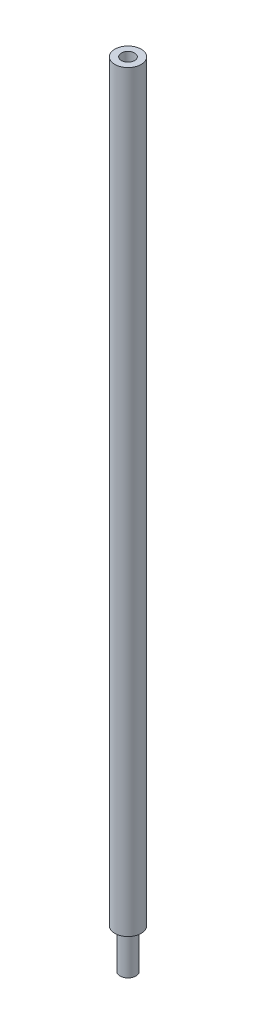
ISO-10303-21;
HEADER;
FILE_DESCRIPTION(('STEP AP214'),'2;1');
FILE_NAME('part.step','',(''),(''),'','','');
FILE_SCHEMA(('AUTOMOTIVE_DESIGN { 1 0 10303 214 1 1 1 1 }'));
ENDSEC;
DATA;
#1=APPLICATION_CONTEXT('core data for automotive mechanical design processes');
#2=APPLICATION_PROTOCOL_DEFINITION('international standard','automotive_design',2000,#1);
#3=PRODUCT_CONTEXT('',#1,'mechanical');
#4=PRODUCT('Part','Part','',(#3));
#5=PRODUCT_RELATED_PRODUCT_CATEGORY('part','',(#4));
#6=PRODUCT_DEFINITION_FORMATION('','',#4);
#7=PRODUCT_DEFINITION_CONTEXT('part definition',#1,'design');
#8=PRODUCT_DEFINITION('design','',#6,#7);
#9=PRODUCT_DEFINITION_SHAPE('','',#8);
#10=(LENGTH_UNIT() NAMED_UNIT(*) SI_UNIT(.MILLI.,.METRE.));
#11=(NAMED_UNIT(*) PLANE_ANGLE_UNIT() SI_UNIT($,.RADIAN.));
#12=(NAMED_UNIT(*) SI_UNIT($,.STERADIAN.) SOLID_ANGLE_UNIT());
#13=UNCERTAINTY_MEASURE_WITH_UNIT(LENGTH_MEASURE(1.E-05),#10,'distance_accuracy_value','');
#14=(GEOMETRIC_REPRESENTATION_CONTEXT(3) GLOBAL_UNCERTAINTY_ASSIGNED_CONTEXT((#13)) GLOBAL_UNIT_ASSIGNED_CONTEXT((#10,
#11,#12)) REPRESENTATION_CONTEXT('',''));
#15=CARTESIAN_POINT('',(0.,0.,0.));
#16=DIRECTION('',(0.,0.,1.));
#17=DIRECTION('',(1.,0.,0.));
#18=AXIS2_PLACEMENT_3D('',#15,#16,#17);
#19=CARTESIAN_POINT('',(0.,64.1903300594672,0.));
#20=DIRECTION('',(0.,-1.,0.));
#21=DIRECTION('',(0.,0.,-1.));
#22=AXIS2_PLACEMENT_3D('',#19,#20,#21);
#23=PLANE('',#22);
#24=CARTESIAN_POINT('',(0.,64.1903300594672,0.));
#25=DIRECTION('',(0.,1.,0.));
#26=DIRECTION('',(0.,0.,1.));
#27=AXIS2_PLACEMENT_3D('',#24,#25,#26);
#28=CIRCLE('',#27,2.5);
#29=CARTESIAN_POINT('',(0.,64.1903300594672,2.5));
#30=VERTEX_POINT('',#29);
#31=EDGE_CURVE('E55',#30,#30,#28,.T.);
#32=ORIENTED_EDGE('',*,*,#31,.F.);
#33=EDGE_LOOP('',(#32));
#34=FACE_BOUND('',#33,.T.);
#35=CARTESIAN_POINT('',(0.,64.1903300594672,0.));
#36=DIRECTION('',(0.,1.,0.));
#37=DIRECTION('',(0.,0.,1.));
#38=AXIS2_PLACEMENT_3D('',#35,#36,#37);
#39=CIRCLE('',#38,5.);
#40=CARTESIAN_POINT('',(0.,64.1903300594672,5.));
#41=VERTEX_POINT('',#40);
#42=EDGE_CURVE('E10',#41,#41,#39,.T.);
#43=ORIENTED_EDGE('',*,*,#42,.T.);
#44=EDGE_LOOP('',(#43));
#45=FACE_BOUND('',#44,.T.);
#46=ADVANCED_FACE('F33',(#34,#45),#23,.F.);
#47=CARTESIAN_POINT('',(0.,68.8439642374539,0.));
#48=DIRECTION('',(0.,1.,0.));
#49=DIRECTION('',(0.,0.,1.));
#50=AXIS2_PLACEMENT_3D('',#47,#48,#49);
#51=CYLINDRICAL_SURFACE('',#50,5.00000000000002);
#52=ORIENTED_EDGE('',*,*,#42,.F.);
#53=EDGE_LOOP('',(#52));
#54=FACE_BOUND('',#53,.T.);
#55=CARTESIAN_POINT('',(0.,-220.809669940533,0.));
#56=DIRECTION('',(0.,1.,0.));
#57=DIRECTION('',(0.,0.,1.));
#58=AXIS2_PLACEMENT_3D('',#55,#56,#57);
#59=CIRCLE('',#58,5.00000000000004);
#60=CARTESIAN_POINT('',(0.,-220.809669940533,5.00000000000004));
#61=VERTEX_POINT('',#60);
#62=EDGE_CURVE('E39',#61,#61,#59,.T.);
#63=ORIENTED_EDGE('',*,*,#62,.T.);
#64=EDGE_LOOP('',(#63));
#65=FACE_BOUND('',#64,.T.);
#66=ADVANCED_FACE('F97',(#54,#65),#51,.T.);
#67=CARTESIAN_POINT('',(0.,-220.809669940533,-5.00000000000004));
#68=DIRECTION('',(0.,1.,0.));
#69=DIRECTION('',(0.,0.,1.));
#70=AXIS2_PLACEMENT_3D('',#67,#68,#69);
#71=PLANE('',#70);
#72=ORIENTED_EDGE('',*,*,#62,.F.);
#73=EDGE_LOOP('',(#72));
#74=FACE_BOUND('',#73,.T.);
#75=CARTESIAN_POINT('',(0.,-220.809669940533,0.));
#76=DIRECTION('',(0.,1.,0.));
#77=DIRECTION('',(0.,0.,1.));
#78=AXIS2_PLACEMENT_3D('',#75,#76,#77);
#79=CIRCLE('',#78,3.00000000000004);
#80=CARTESIAN_POINT('',(0.,-220.809669940533,3.00000000000004));
#81=VERTEX_POINT('',#80);
#82=EDGE_CURVE('E43',#81,#81,#79,.T.);
#83=ORIENTED_EDGE('',*,*,#82,.T.);
#84=EDGE_LOOP('',(#83));
#85=FACE_BOUND('',#84,.T.);
#86=ADVANCED_FACE('F102',(#74,#85),#71,.F.);
#87=CARTESIAN_POINT('',(0.,68.8439642374539,0.));
#88=DIRECTION('',(0.,1.,0.));
#89=DIRECTION('',(0.,0.,1.));
#90=AXIS2_PLACEMENT_3D('',#87,#88,#89);
#91=CYLINDRICAL_SURFACE('',#90,3.00000000000004);
#92=ORIENTED_EDGE('',*,*,#82,.F.);
#93=EDGE_LOOP('',(#92));
#94=FACE_BOUND('',#93,.T.);
#95=CARTESIAN_POINT('',(0.,-235.809669940533,0.));
#96=DIRECTION('',(0.,1.,0.));
#97=DIRECTION('',(0.,0.,1.));
#98=AXIS2_PLACEMENT_3D('',#95,#96,#97);
#99=CIRCLE('',#98,3.00000000000004);
#100=CARTESIAN_POINT('',(0.,-235.809669940533,3.00000000000004));
#101=VERTEX_POINT('',#100);
#102=EDGE_CURVE('E47',#101,#101,#99,.T.);
#103=ORIENTED_EDGE('',*,*,#102,.T.);
#104=EDGE_LOOP('',(#103));
#105=FACE_BOUND('',#104,.T.);
#106=ADVANCED_FACE('F122',(#94,#105),#91,.T.);
#107=CARTESIAN_POINT('',(0.,-235.809669940533,-3.00000000000004));
#108=DIRECTION('',(0.,1.,0.));
#109=DIRECTION('',(0.,0.,1.));
#110=AXIS2_PLACEMENT_3D('',#107,#108,#109);
#111=PLANE('',#110);
#112=CARTESIAN_POINT('',(0.,-235.809669940533,0.));
#113=DIRECTION('',(0.,1.,0.));
#114=DIRECTION('',(0.,0.,1.));
#115=AXIS2_PLACEMENT_3D('',#112,#113,#114);
#116=CIRCLE('',#115,2.00000000000004);
#117=CARTESIAN_POINT('',(0.,-235.809669940533,2.00000000000004));
#118=VERTEX_POINT('',#117);
#119=EDGE_CURVE('E52',#118,#118,#116,.T.);
#120=ORIENTED_EDGE('',*,*,#119,.T.);
#121=EDGE_LOOP('',(#120));
#122=FACE_BOUND('',#121,.T.);
#123=ORIENTED_EDGE('',*,*,#102,.F.);
#124=EDGE_LOOP('',(#123));
#125=FACE_BOUND('',#124,.T.);
#126=ADVANCED_FACE('F115',(#122,#125),#111,.F.);
#127=CARTESIAN_POINT('',(0.,-235.809669940533,0.));
#128=DIRECTION('',(0.,1.,0.));
#129=DIRECTION('',(0.,0.,1.));
#130=AXIS2_PLACEMENT_3D('',#127,#128,#129);
#131=CYLINDRICAL_SURFACE('',#130,2.00000000000004);
#132=ORIENTED_EDGE('',*,*,#119,.F.);
#133=EDGE_LOOP('',(#132));
#134=FACE_BOUND('',#133,.T.);
#135=CARTESIAN_POINT('',(0.,-219.809669940533,0.));
#136=DIRECTION('',(0.,1.,0.));
#137=DIRECTION('',(0.,0.,1.));
#138=AXIS2_PLACEMENT_3D('',#135,#136,#137);
#139=CIRCLE('',#138,2.00000000000004);
#140=CARTESIAN_POINT('',(0.,-219.809669940533,2.00000000000004));
#141=VERTEX_POINT('',#140);
#142=EDGE_CURVE('E65',#141,#141,#139,.T.);
#143=ORIENTED_EDGE('',*,*,#142,.T.);
#144=EDGE_LOOP('',(#143));
#145=FACE_BOUND('',#144,.T.);
#146=ADVANCED_FACE('F108',(#134,#145),#131,.F.);
#147=CARTESIAN_POINT('',(0.,49.1903300594672,0.));
#148=DIRECTION('',(0.,1.,0.));
#149=DIRECTION('',(0.,0.,1.));
#150=AXIS2_PLACEMENT_3D('',#147,#148,#149);
#151=CYLINDRICAL_SURFACE('',#150,2.5);
#152=CARTESIAN_POINT('',(0.,49.1903300594672,0.));
#153=DIRECTION('',(0.,1.,0.));
#154=DIRECTION('',(0.,0.,1.));
#155=AXIS2_PLACEMENT_3D('',#152,#153,#154);
#156=CIRCLE('',#155,2.5);
#157=CARTESIAN_POINT('',(0.,49.1903300594672,2.5));
#158=VERTEX_POINT('',#157);
#159=EDGE_CURVE('E58',#158,#158,#156,.T.);
#160=ORIENTED_EDGE('',*,*,#159,.F.);
#161=EDGE_LOOP('',(#160));
#162=FACE_BOUND('',#161,.T.);
#163=ORIENTED_EDGE('',*,*,#31,.T.);
#164=EDGE_LOOP('',(#163));
#165=FACE_BOUND('',#164,.T.);
#166=ADVANCED_FACE('F106',(#162,#165),#151,.F.);
#167=CARTESIAN_POINT('',(0.,63.1903300594672,0.));
#168=DIRECTION('',(0.,-1.,0.));
#169=DIRECTION('',(0.,0.,-1.));
#170=AXIS2_PLACEMENT_3D('',#167,#168,#169);
#171=PLANE('',#170);
#172=CARTESIAN_POINT('',(0.,63.1903300594672,0.));
#173=DIRECTION('',(0.,-1.,0.));
#174=DIRECTION('',(0.,0.,-1.));
#175=AXIS2_PLACEMENT_3D('',#172,#173,#174);
#176=CIRCLE('',#175,3.5);
#177=CARTESIAN_POINT('',(0.,63.1903300594672,-3.5));
#178=VERTEX_POINT('',#177);
#179=EDGE_CURVE('E66',#178,#178,#176,.F.);
#180=ORIENTED_EDGE('',*,*,#179,.T.);
#181=EDGE_LOOP('',(#180));
#182=FACE_BOUND('',#181,.T.);
#183=CARTESIAN_POINT('',(0.,63.1903300594672,0.));
#184=DIRECTION('',(0.,-1.,0.));
#185=DIRECTION('',(0.,0.,-1.));
#186=AXIS2_PLACEMENT_3D('',#183,#184,#185);
#187=CIRCLE('',#186,4.00000000000002);
#188=CARTESIAN_POINT('',(0.,63.1903300594672,-4.00000000000002));
#189=VERTEX_POINT('',#188);
#190=EDGE_CURVE('E61',#189,#189,#187,.F.);
#191=ORIENTED_EDGE('',*,*,#190,.F.);
#192=EDGE_LOOP('',(#191));
#193=FACE_BOUND('',#192,.T.);
#194=ADVANCED_FACE('F77',(#182,#193),#171,.T.);
#195=CARTESIAN_POINT('',(0.,68.8439642374539,0.));
#196=DIRECTION('',(0.,1.,0.));
#197=DIRECTION('',(0.,0.,1.));
#198=AXIS2_PLACEMENT_3D('',#195,#196,#197);
#199=CYLINDRICAL_SURFACE('',#198,4.00000000000002);
#200=ORIENTED_EDGE('',*,*,#190,.T.);
#201=EDGE_LOOP('',(#200));
#202=FACE_BOUND('',#201,.T.);
#203=CARTESIAN_POINT('',(0.,-219.809669940533,0.));
#204=DIRECTION('',(0.,1.,0.));
#205=DIRECTION('',(0.,0.,1.));
#206=AXIS2_PLACEMENT_3D('',#203,#204,#205);
#207=CIRCLE('',#206,4.00000000000002);
#208=CARTESIAN_POINT('',(0.,-219.809669940533,4.00000000000002));
#209=VERTEX_POINT('',#208);
#210=EDGE_CURVE('E69',#209,#209,#207,.T.);
#211=ORIENTED_EDGE('',*,*,#210,.F.);
#212=EDGE_LOOP('',(#211));
#213=FACE_BOUND('',#212,.T.);
#214=ADVANCED_FACE('F92',(#202,#213),#199,.F.);
#215=CARTESIAN_POINT('',(0.,-219.809669940533,-5.00000000000004));
#216=DIRECTION('',(0.,1.,0.));
#217=DIRECTION('',(0.,0.,1.));
#218=AXIS2_PLACEMENT_3D('',#215,#216,#217);
#219=PLANE('',#218);
#220=ORIENTED_EDGE('',*,*,#210,.T.);
#221=EDGE_LOOP('',(#220));
#222=FACE_BOUND('',#221,.T.);
#223=ORIENTED_EDGE('',*,*,#142,.F.);
#224=EDGE_LOOP('',(#223));
#225=FACE_BOUND('',#224,.T.);
#226=ADVANCED_FACE('F83',(#222,#225),#219,.T.);
#227=CARTESIAN_POINT('',(0.,49.1903300594672,0.));
#228=DIRECTION('',(0.,1.,0.));
#229=DIRECTION('',(0.,0.,1.));
#230=AXIS2_PLACEMENT_3D('',#227,#228,#229);
#231=CYLINDRICAL_SURFACE('',#230,3.5);
#232=CARTESIAN_POINT('',(0.,49.1903300594672,0.));
#233=DIRECTION('',(0.,1.,0.));
#234=DIRECTION('',(0.,0.,1.));
#235=AXIS2_PLACEMENT_3D('',#232,#233,#234);
#236=CIRCLE('',#235,3.5);
#237=CARTESIAN_POINT('',(0.,49.1903300594672,3.5));
#238=VERTEX_POINT('',#237);
#239=EDGE_CURVE('E62',#238,#238,#236,.T.);
#240=ORIENTED_EDGE('',*,*,#239,.T.);
#241=EDGE_LOOP('',(#240));
#242=FACE_BOUND('',#241,.T.);
#243=ORIENTED_EDGE('',*,*,#179,.F.);
#244=EDGE_LOOP('',(#243));
#245=FACE_BOUND('',#244,.T.);
#246=ADVANCED_FACE('F80',(#242,#245),#231,.T.);
#247=CARTESIAN_POINT('',(0.,49.1903300594672,0.));
#248=DIRECTION('',(0.,1.,0.));
#249=DIRECTION('',(0.,0.,1.));
#250=AXIS2_PLACEMENT_3D('',#247,#248,#249);
#251=PLANE('',#250);
#252=ORIENTED_EDGE('',*,*,#159,.T.);
#253=EDGE_LOOP('',(#252));
#254=FACE_BOUND('',#253,.T.);
#255=ORIENTED_EDGE('',*,*,#239,.F.);
#256=EDGE_LOOP('',(#255));
#257=FACE_BOUND('',#256,.T.);
#258=ADVANCED_FACE('F82',(#254,#257),#251,.F.);
#259=CLOSED_SHELL('',(#46,#66,#86,#106,#126,#146,#166,#194,#214,#226,#246,#258));
#260=MANIFOLD_SOLID_BREP('B2',#259);
#261=ADVANCED_BREP_SHAPE_REPRESENTATION('',(#18,#260),#14);
#262=SHAPE_DEFINITION_REPRESENTATION(#9,#261);
ENDSEC;
END-ISO-10303-21;
